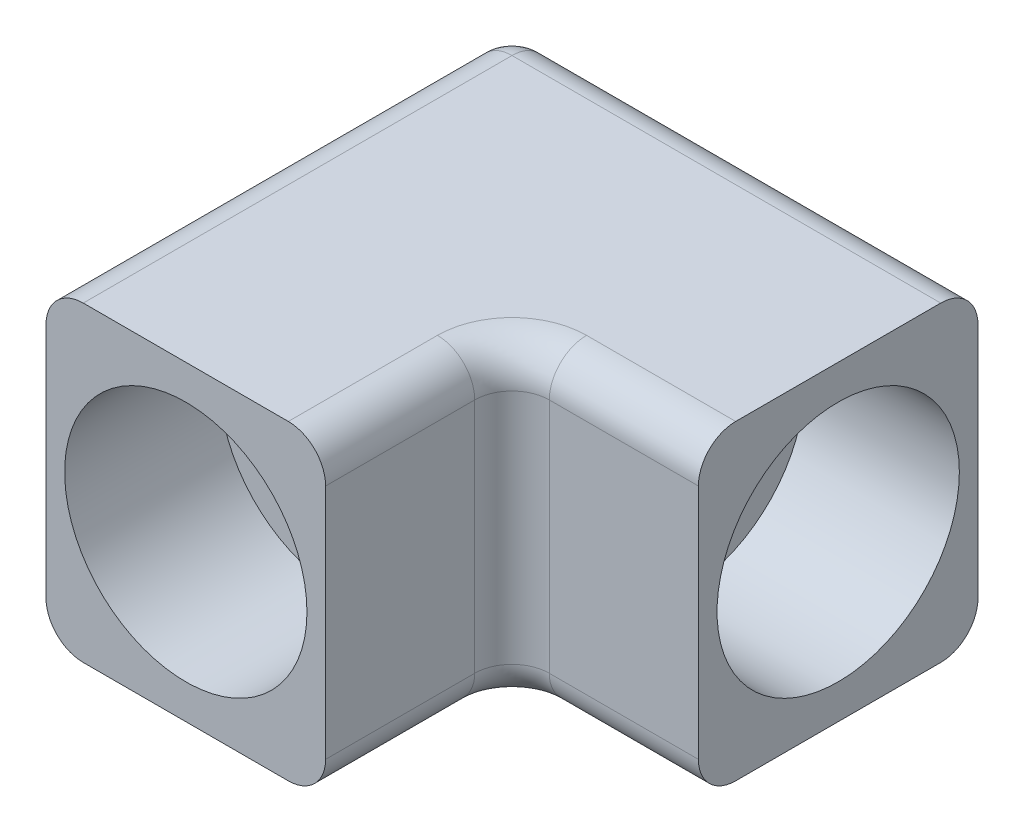
ISO-10303-21;
HEADER;
FILE_DESCRIPTION(('STEP AP214'),'2;1');
FILE_NAME('part.step','',(''),(''),'','','');
FILE_SCHEMA(('AUTOMOTIVE_DESIGN { 1 0 10303 214 1 1 1 1 }'));
ENDSEC;
DATA;
#1=APPLICATION_CONTEXT('core data for automotive mechanical design processes');
#2=APPLICATION_PROTOCOL_DEFINITION('international standard','automotive_design',2000,#1);
#3=PRODUCT_CONTEXT('',#1,'mechanical');
#4=PRODUCT('Part','Part','',(#3));
#5=PRODUCT_RELATED_PRODUCT_CATEGORY('part','',(#4));
#6=PRODUCT_DEFINITION_FORMATION('','',#4);
#7=PRODUCT_DEFINITION_CONTEXT('part definition',#1,'design');
#8=PRODUCT_DEFINITION('design','',#6,#7);
#9=PRODUCT_DEFINITION_SHAPE('','',#8);
#10=(LENGTH_UNIT() NAMED_UNIT(*) SI_UNIT(.MILLI.,.METRE.));
#11=(NAMED_UNIT(*) PLANE_ANGLE_UNIT() SI_UNIT($,.RADIAN.));
#12=(NAMED_UNIT(*) SI_UNIT($,.STERADIAN.) SOLID_ANGLE_UNIT());
#13=UNCERTAINTY_MEASURE_WITH_UNIT(LENGTH_MEASURE(1.E-05),#10,'distance_accuracy_value','');
#14=(GEOMETRIC_REPRESENTATION_CONTEXT(3) GLOBAL_UNCERTAINTY_ASSIGNED_CONTEXT((#13)) GLOBAL_UNIT_ASSIGNED_CONTEXT((#10,
#11,#12)) REPRESENTATION_CONTEXT('',''));
#15=CARTESIAN_POINT('',(0.,0.,0.));
#16=DIRECTION('',(0.,0.,1.));
#17=DIRECTION('',(1.,0.,0.));
#18=AXIS2_PLACEMENT_3D('',#15,#16,#17);
#19=CARTESIAN_POINT('',(0.,0.,0.));
#20=DIRECTION('',(0.,1.,0.));
#21=DIRECTION('',(0.,0.,1.));
#22=AXIS2_PLACEMENT_3D('',#19,#20,#21);
#23=PLANE('',#22);
#24=DIRECTION('',(-1.,0.,0.));
#25=VECTOR('',#24,1.);
#26=CARTESIAN_POINT('',(0.,0.,5.));
#27=LINE('',#26,#25);
#28=CARTESIAN_POINT('',(5.5,0.,5.));
#29=VERTEX_POINT('',#28);
#30=CARTESIAN_POINT('',(-5.5,0.,5.));
#31=VERTEX_POINT('',#30);
#32=EDGE_CURVE('E392',#29,#31,#27,.T.);
#33=ORIENTED_EDGE('',*,*,#32,.T.);
#34=DIRECTION('',(0.,0.,-1.));
#35=VECTOR('',#34,1.);
#36=CARTESIAN_POINT('',(-5.49999999999999,0.,-20.));
#37=LINE('',#36,#35);
#38=CARTESIAN_POINT('',(-5.49999999999999,0.,-9.03589838486224));
#39=VERTEX_POINT('',#38);
#40=EDGE_CURVE('E266',#31,#39,#37,.T.);
#41=ORIENTED_EDGE('',*,*,#40,.T.);
#42=CARTESIAN_POINT('',(0.,0.,-12.5));
#43=DIRECTION('',(0.,-1.,0.));
#44=DIRECTION('',(0.,0.,-1.));
#45=AXIS2_PLACEMENT_3D('',#42,#43,#44);
#46=CIRCLE('',#45,6.5);
#47=CARTESIAN_POINT('',(3.46410161513776,0.,-18.));
#48=VERTEX_POINT('',#47);
#49=EDGE_CURVE('E480',#48,#39,#46,.T.);
#50=ORIENTED_EDGE('',*,*,#49,.F.);
#51=DIRECTION('',(1.,0.,0.));
#52=VECTOR('',#51,1.);
#53=CARTESIAN_POINT('',(17.5,0.,-18.));
#54=LINE('',#53,#52);
#55=CARTESIAN_POINT('',(17.5,0.,-18.));
#56=VERTEX_POINT('',#55);
#57=EDGE_CURVE('E182',#48,#56,#54,.T.);
#58=ORIENTED_EDGE('',*,*,#57,.T.);
#59=DIRECTION('',(0.,0.,-1.));
#60=VECTOR('',#59,1.);
#61=CARTESIAN_POINT('',(17.5,0.,0.));
#62=LINE('',#61,#60);
#63=CARTESIAN_POINT('',(17.5,0.,-7.));
#64=VERTEX_POINT('',#63);
#65=EDGE_CURVE('E193',#64,#56,#62,.T.);
#66=ORIENTED_EDGE('',*,*,#65,.F.);
#67=DIRECTION('',(1.,0.,0.));
#68=VECTOR('',#67,1.);
#69=CARTESIAN_POINT('',(0.,0.,-7.));
#70=LINE('',#69,#68);
#71=CARTESIAN_POINT('',(9.5,0.,-7.));
#72=VERTEX_POINT('',#71);
#73=EDGE_CURVE('E260',#64,#72,#70,.F.);
#74=ORIENTED_EDGE('',*,*,#73,.T.);
#75=CARTESIAN_POINT('',(9.5,0.,-3.));
#76=DIRECTION('',(0.,1.,0.));
#77=DIRECTION('',(0.,0.,1.));
#78=AXIS2_PLACEMENT_3D('',#75,#76,#77);
#79=CIRCLE('',#78,4.);
#80=CARTESIAN_POINT('',(5.5,0.,-3.));
#81=VERTEX_POINT('',#80);
#82=EDGE_CURVE('E256',#81,#72,#79,.F.);
#83=ORIENTED_EDGE('',*,*,#82,.F.);
#84=DIRECTION('',(0.,0.,-1.));
#85=VECTOR('',#84,1.);
#86=CARTESIAN_POINT('',(5.5,0.,0.));
#87=LINE('',#86,#85);
#88=EDGE_CURVE('E263',#81,#29,#87,.F.);
#89=ORIENTED_EDGE('',*,*,#88,.T.);
#90=EDGE_LOOP('',(#33,#41,#50,#58,#66,#74,#83,#89));
#91=FACE_BOUND('',#90,.T.);
#92=ADVANCED_FACE('F51',(#91),#23,.F.);
#93=CARTESIAN_POINT('',(-7.5,16.7,0.));
#94=DIRECTION('',(-1.,0.,0.));
#95=DIRECTION('',(0.,0.,1.));
#96=AXIS2_PLACEMENT_3D('',#93,#94,#95);
#97=PLANE('',#96);
#98=DIRECTION('',(0.,-1.,0.));
#99=VECTOR('',#98,1.);
#100=CARTESIAN_POINT('',(-7.49999999999999,16.7,-18.));
#101=LINE('',#100,#99);
#102=CARTESIAN_POINT('',(-7.49999999999999,14.7,-18.));
#103=VERTEX_POINT('',#102);
#104=CARTESIAN_POINT('',(-7.49999999999999,2.,-18.));
#105=VERTEX_POINT('',#104);
#106=EDGE_CURVE('E408',#103,#105,#101,.T.);
#107=ORIENTED_EDGE('',*,*,#106,.T.);
#108=DIRECTION('',(0.,0.,-1.));
#109=VECTOR('',#108,1.);
#110=CARTESIAN_POINT('',(-7.5,2.,5.));
#111=LINE('',#110,#109);
#112=CARTESIAN_POINT('',(-7.5,2.,5.));
#113=VERTEX_POINT('',#112);
#114=EDGE_CURVE('E414',#105,#113,#111,.F.);
#115=ORIENTED_EDGE('',*,*,#114,.T.);
#116=DIRECTION('',(0.,-1.,0.));
#117=VECTOR('',#116,1.);
#118=CARTESIAN_POINT('',(-7.5,16.7,5.));
#119=LINE('',#118,#117);
#120=CARTESIAN_POINT('',(-7.5,14.7,5.));
#121=VERTEX_POINT('',#120);
#122=EDGE_CURVE('E518',#121,#113,#119,.T.);
#123=ORIENTED_EDGE('',*,*,#122,.F.);
#124=DIRECTION('',(0.,0.,-1.));
#125=VECTOR('',#124,1.);
#126=CARTESIAN_POINT('',(-7.5,14.7,0.));
#127=LINE('',#126,#125);
#128=EDGE_CURVE('E410',#121,#103,#127,.T.);
#129=ORIENTED_EDGE('',*,*,#128,.T.);
#130=EDGE_LOOP('',(#107,#115,#123,#129));
#131=FACE_BOUND('',#130,.T.);
#132=ADVANCED_FACE('F340',(#131),#97,.T.);
#133=CARTESIAN_POINT('',(0.,16.7,5.));
#134=DIRECTION('',(0.,0.,1.));
#135=DIRECTION('',(1.,0.,0.));
#136=AXIS2_PLACEMENT_3D('',#133,#134,#135);
#137=PLANE('',#136);
#138=CARTESIAN_POINT('',(0.,8.35,5.));
#139=DIRECTION('',(0.,0.,1.));
#140=DIRECTION('',(1.,0.,0.));
#141=AXIS2_PLACEMENT_3D('',#138,#139,#140);
#142=CIRCLE('',#141,6.5);
#143=CARTESIAN_POINT('',(6.5,8.35,5.));
#144=VERTEX_POINT('',#143);
#145=EDGE_CURVE('E496',#144,#144,#142,.T.);
#146=ORIENTED_EDGE('',*,*,#145,.F.);
#147=EDGE_LOOP('',(#146));
#148=FACE_BOUND('',#147,.T.);
#149=DIRECTION('',(0.,-1.,0.));
#150=VECTOR('',#149,1.);
#151=CARTESIAN_POINT('',(7.5,16.7,5.));
#152=LINE('',#151,#150);
#153=CARTESIAN_POINT('',(7.5,14.7,5.));
#154=VERTEX_POINT('',#153);
#155=CARTESIAN_POINT('',(7.5,2.,5.));
#156=VERTEX_POINT('',#155);
#157=EDGE_CURVE('E177',#154,#156,#152,.T.);
#158=ORIENTED_EDGE('',*,*,#157,.F.);
#159=CARTESIAN_POINT('',(5.5,14.7,5.));
#160=DIRECTION('',(0.,0.,1.));
#161=DIRECTION('',(1.,0.,0.));
#162=AXIS2_PLACEMENT_3D('',#159,#160,#161);
#163=CIRCLE('',#162,2.);
#164=CARTESIAN_POINT('',(5.5,16.7,5.));
#165=VERTEX_POINT('',#164);
#166=EDGE_CURVE('E171',#154,#165,#163,.T.);
#167=ORIENTED_EDGE('',*,*,#166,.T.);
#168=DIRECTION('',(-1.,0.,0.));
#169=VECTOR('',#168,1.);
#170=CARTESIAN_POINT('',(0.,16.7,5.));
#171=LINE('',#170,#169);
#172=CARTESIAN_POINT('',(-5.5,16.7,5.));
#173=VERTEX_POINT('',#172);
#174=EDGE_CURVE('E174',#165,#173,#171,.T.);
#175=ORIENTED_EDGE('',*,*,#174,.T.);
#176=CARTESIAN_POINT('',(-5.5,14.7,5.));
#177=DIRECTION('',(0.,0.,1.));
#178=DIRECTION('',(1.,0.,0.));
#179=AXIS2_PLACEMENT_3D('',#176,#177,#178);
#180=CIRCLE('',#179,2.);
#181=EDGE_CURVE('E243',#173,#121,#180,.T.);
#182=ORIENTED_EDGE('',*,*,#181,.T.);
#183=ORIENTED_EDGE('',*,*,#122,.T.);
#184=CARTESIAN_POINT('',(-5.5,2.,5.));
#185=DIRECTION('',(0.,0.,1.));
#186=DIRECTION('',(1.,0.,0.));
#187=AXIS2_PLACEMENT_3D('',#184,#185,#186);
#188=CIRCLE('',#187,2.);
#189=EDGE_CURVE('E183',#113,#31,#188,.T.);
#190=ORIENTED_EDGE('',*,*,#189,.T.);
#191=ORIENTED_EDGE('',*,*,#32,.F.);
#192=CARTESIAN_POINT('',(5.5,2.,5.));
#193=DIRECTION('',(0.,0.,1.));
#194=DIRECTION('',(1.,0.,0.));
#195=AXIS2_PLACEMENT_3D('',#192,#193,#194);
#196=CIRCLE('',#195,2.);
#197=EDGE_CURVE('E240',#29,#156,#196,.T.);
#198=ORIENTED_EDGE('',*,*,#197,.T.);
#199=EDGE_LOOP('',(#158,#167,#175,#182,#183,#190,#191,#198));
#200=FACE_BOUND('',#199,.T.);
#201=ADVANCED_FACE('F173',(#148,#200),#137,.T.);
#202=CARTESIAN_POINT('',(7.5,16.7,0.));
#203=DIRECTION('',(-1.,0.,0.));
#204=DIRECTION('',(0.,0.,1.));
#205=AXIS2_PLACEMENT_3D('',#202,#203,#204);
#206=PLANE('',#205);
#207=DIRECTION('',(0.,-1.,0.));
#208=VECTOR('',#207,1.);
#209=CARTESIAN_POINT('',(7.5,16.7,-3.));
#210=LINE('',#209,#208);
#211=CARTESIAN_POINT('',(7.5,2.,-3.));
#212=VERTEX_POINT('',#211);
#213=CARTESIAN_POINT('',(7.5,14.7,-3.));
#214=VERTEX_POINT('',#213);
#215=EDGE_CURVE('E231',#212,#214,#210,.F.);
#216=ORIENTED_EDGE('',*,*,#215,.T.);
#217=DIRECTION('',(0.,0.,-1.));
#218=VECTOR('',#217,1.);
#219=CARTESIAN_POINT('',(7.5,14.7,5.));
#220=LINE('',#219,#218);
#221=EDGE_CURVE('E237',#214,#154,#220,.F.);
#222=ORIENTED_EDGE('',*,*,#221,.T.);
#223=ORIENTED_EDGE('',*,*,#157,.T.);
#224=DIRECTION('',(0.,0.,-1.));
#225=VECTOR('',#224,1.);
#226=CARTESIAN_POINT('',(7.5,2.,0.));
#227=LINE('',#226,#225);
#228=EDGE_CURVE('E234',#156,#212,#227,.T.);
#229=ORIENTED_EDGE('',*,*,#228,.T.);
#230=EDGE_LOOP('',(#216,#222,#223,#229));
#231=FACE_BOUND('',#230,.T.);
#232=ADVANCED_FACE('F333',(#231),#206,.F.);
#233=CARTESIAN_POINT('',(0.,16.7,-5.));
#234=DIRECTION('',(0.,0.,-1.));
#235=DIRECTION('',(-1.,0.,0.));
#236=AXIS2_PLACEMENT_3D('',#233,#234,#235);
#237=PLANE('',#236);
#238=DIRECTION('',(0.,-1.,0.));
#239=VECTOR('',#238,1.);
#240=CARTESIAN_POINT('',(17.5,16.7,-5.));
#241=LINE('',#240,#239);
#242=CARTESIAN_POINT('',(17.5,14.7,-5.));
#243=VERTEX_POINT('',#242);
#244=CARTESIAN_POINT('',(17.5,2.,-5.));
#245=VERTEX_POINT('',#244);
#246=EDGE_CURVE('E512',#243,#245,#241,.T.);
#247=ORIENTED_EDGE('',*,*,#246,.F.);
#248=DIRECTION('',(1.,0.,0.));
#249=VECTOR('',#248,1.);
#250=CARTESIAN_POINT('',(7.5,14.7,-5.));
#251=LINE('',#250,#249);
#252=CARTESIAN_POINT('',(9.5,14.7,-5.));
#253=VERTEX_POINT('',#252);
#254=EDGE_CURVE('E228',#243,#253,#251,.F.);
#255=ORIENTED_EDGE('',*,*,#254,.T.);
#256=DIRECTION('',(0.,-1.,0.));
#257=VECTOR('',#256,1.);
#258=CARTESIAN_POINT('',(9.5,0.,-5.));
#259=LINE('',#258,#257);
#260=CARTESIAN_POINT('',(9.5,2.,-5.));
#261=VERTEX_POINT('',#260);
#262=EDGE_CURVE('E222',#253,#261,#259,.T.);
#263=ORIENTED_EDGE('',*,*,#262,.T.);
#264=DIRECTION('',(1.,0.,0.));
#265=VECTOR('',#264,1.);
#266=CARTESIAN_POINT('',(0.,2.,-5.));
#267=LINE('',#266,#265);
#268=EDGE_CURVE('E225',#261,#245,#267,.T.);
#269=ORIENTED_EDGE('',*,*,#268,.T.);
#270=EDGE_LOOP('',(#247,#255,#263,#269));
#271=FACE_BOUND('',#270,.T.);
#272=ADVANCED_FACE('F329',(#271),#237,.F.);
#273=CARTESIAN_POINT('',(17.5,16.7,0.));
#274=DIRECTION('',(-1.,0.,0.));
#275=DIRECTION('',(0.,0.,1.));
#276=AXIS2_PLACEMENT_3D('',#273,#274,#275);
#277=PLANE('',#276);
#278=CARTESIAN_POINT('',(17.5,8.35,-12.5));
#279=DIRECTION('',(1.,0.,0.));
#280=DIRECTION('',(0.,0.,-1.));
#281=AXIS2_PLACEMENT_3D('',#278,#279,#280);
#282=CIRCLE('',#281,6.5);
#283=CARTESIAN_POINT('',(17.5,8.35,-19.));
#284=VERTEX_POINT('',#283);
#285=EDGE_CURVE('E488',#284,#284,#282,.T.);
#286=ORIENTED_EDGE('',*,*,#285,.F.);
#287=EDGE_LOOP('',(#286));
#288=FACE_BOUND('',#287,.T.);
#289=DIRECTION('',(0.,0.,-1.));
#290=VECTOR('',#289,1.);
#291=CARTESIAN_POINT('',(17.5,16.7,0.));
#292=LINE('',#291,#290);
#293=CARTESIAN_POINT('',(17.5,16.7,-7.));
#294=VERTEX_POINT('',#293);
#295=CARTESIAN_POINT('',(17.5,16.7,-18.));
#296=VERTEX_POINT('',#295);
#297=EDGE_CURVE('E192',#294,#296,#292,.T.);
#298=ORIENTED_EDGE('',*,*,#297,.F.);
#299=CARTESIAN_POINT('',(17.5,14.7,-7.));
#300=DIRECTION('',(-1.,0.,0.));
#301=DIRECTION('',(0.,0.,1.));
#302=AXIS2_PLACEMENT_3D('',#299,#300,#301);
#303=CIRCLE('',#302,2.);
#304=EDGE_CURVE('E219',#294,#243,#303,.F.);
#305=ORIENTED_EDGE('',*,*,#304,.T.);
#306=ORIENTED_EDGE('',*,*,#246,.T.);
#307=CARTESIAN_POINT('',(17.5,2.,-7.));
#308=DIRECTION('',(-1.,0.,0.));
#309=DIRECTION('',(0.,0.,1.));
#310=AXIS2_PLACEMENT_3D('',#307,#308,#309);
#311=CIRCLE('',#310,2.);
#312=EDGE_CURVE('E216',#245,#64,#311,.F.);
#313=ORIENTED_EDGE('',*,*,#312,.T.);
#314=ORIENTED_EDGE('',*,*,#65,.T.);
#315=CARTESIAN_POINT('',(17.5,2.,-18.));
#316=DIRECTION('',(-1.,0.,0.));
#317=DIRECTION('',(0.,0.,1.));
#318=AXIS2_PLACEMENT_3D('',#315,#316,#317);
#319=CIRCLE('',#318,2.);
#320=CARTESIAN_POINT('',(17.5,2.,-20.));
#321=VERTEX_POINT('',#320);
#322=EDGE_CURVE('E206',#56,#321,#319,.F.);
#323=ORIENTED_EDGE('',*,*,#322,.T.);
#324=DIRECTION('',(0.,-1.,0.));
#325=VECTOR('',#324,1.);
#326=CARTESIAN_POINT('',(17.5,16.7,-20.));
#327=LINE('',#326,#325);
#328=CARTESIAN_POINT('',(17.5,14.7,-20.));
#329=VERTEX_POINT('',#328);
#330=EDGE_CURVE('E505',#329,#321,#327,.T.);
#331=ORIENTED_EDGE('',*,*,#330,.F.);
#332=CARTESIAN_POINT('',(17.5,14.7,-18.));
#333=DIRECTION('',(-1.,0.,0.));
#334=DIRECTION('',(0.,0.,1.));
#335=AXIS2_PLACEMENT_3D('',#332,#333,#334);
#336=CIRCLE('',#335,2.);
#337=EDGE_CURVE('E213',#329,#296,#336,.F.);
#338=ORIENTED_EDGE('',*,*,#337,.T.);
#339=EDGE_LOOP('',(#298,#305,#306,#313,#314,#323,#331,#338));
#340=FACE_BOUND('',#339,.T.);
#341=ADVANCED_FACE('F326',(#288,#340),#277,.F.);
#342=CARTESIAN_POINT('',(0.,16.7,-20.));
#343=DIRECTION('',(0.,0.,-1.));
#344=DIRECTION('',(-1.,0.,0.));
#345=AXIS2_PLACEMENT_3D('',#342,#343,#344);
#346=PLANE('',#345);
#347=DIRECTION('',(0.,-1.,0.));
#348=VECTOR('',#347,1.);
#349=CARTESIAN_POINT('',(-5.49999999999999,16.7,-20.));
#350=LINE('',#349,#348);
#351=CARTESIAN_POINT('',(-5.49999999999999,2.,-20.));
#352=VERTEX_POINT('',#351);
#353=CARTESIAN_POINT('',(-5.49999999999999,14.7,-20.));
#354=VERTEX_POINT('',#353);
#355=EDGE_CURVE('E68',#352,#354,#350,.F.);
#356=ORIENTED_EDGE('',*,*,#355,.T.);
#357=DIRECTION('',(1.,0.,0.));
#358=VECTOR('',#357,1.);
#359=CARTESIAN_POINT('',(0.,14.7,-20.));
#360=LINE('',#359,#358);
#361=EDGE_CURVE('E12',#354,#329,#360,.T.);
#362=ORIENTED_EDGE('',*,*,#361,.T.);
#363=ORIENTED_EDGE('',*,*,#330,.T.);
#364=DIRECTION('',(1.,0.,0.));
#365=VECTOR('',#364,1.);
#366=CARTESIAN_POINT('',(-7.5,2.,-20.));
#367=LINE('',#366,#365);
#368=EDGE_CURVE('E61',#321,#352,#367,.F.);
#369=ORIENTED_EDGE('',*,*,#368,.T.);
#370=EDGE_LOOP('',(#356,#362,#363,#369));
#371=FACE_BOUND('',#370,.T.);
#372=ADVANCED_FACE('F320',(#371),#346,.T.);
#373=CARTESIAN_POINT('',(0.,16.7,0.));
#374=DIRECTION('',(0.,1.,0.));
#375=DIRECTION('',(0.,0.,1.));
#376=AXIS2_PLACEMENT_3D('',#373,#374,#375);
#377=PLANE('',#376);
#378=CARTESIAN_POINT('',(9.5,16.7,-3.));
#379=DIRECTION('',(0.,1.,0.));
#380=DIRECTION('',(0.,0.,1.));
#381=AXIS2_PLACEMENT_3D('',#378,#379,#380);
#382=CIRCLE('',#381,4.);
#383=CARTESIAN_POINT('',(9.5,16.7,-7.));
#384=VERTEX_POINT('',#383);
#385=CARTESIAN_POINT('',(5.5,16.7,-3.));
#386=VERTEX_POINT('',#385);
#387=EDGE_CURVE('E201',#384,#386,#382,.T.);
#388=ORIENTED_EDGE('',*,*,#387,.F.);
#389=DIRECTION('',(1.,0.,0.));
#390=VECTOR('',#389,1.);
#391=CARTESIAN_POINT('',(17.5,16.7,-7.));
#392=LINE('',#391,#390);
#393=EDGE_CURVE('E200',#384,#294,#392,.T.);
#394=ORIENTED_EDGE('',*,*,#393,.T.);
#395=ORIENTED_EDGE('',*,*,#297,.T.);
#396=DIRECTION('',(1.,0.,0.));
#397=VECTOR('',#396,1.);
#398=CARTESIAN_POINT('',(0.,16.7,-18.));
#399=LINE('',#398,#397);
#400=CARTESIAN_POINT('',(-5.49999999999999,16.7,-18.));
#401=VERTEX_POINT('',#400);
#402=EDGE_CURVE('E521',#296,#401,#399,.F.);
#403=ORIENTED_EDGE('',*,*,#402,.T.);
#404=DIRECTION('',(0.,0.,-1.));
#405=VECTOR('',#404,1.);
#406=CARTESIAN_POINT('',(-5.5,16.7,0.));
#407=LINE('',#406,#405);
#408=EDGE_CURVE('E190',#401,#173,#407,.F.);
#409=ORIENTED_EDGE('',*,*,#408,.T.);
#410=ORIENTED_EDGE('',*,*,#174,.F.);
#411=DIRECTION('',(0.,0.,-1.));
#412=VECTOR('',#411,1.);
#413=CARTESIAN_POINT('',(5.5,16.7,-5.));
#414=LINE('',#413,#412);
#415=EDGE_CURVE('E187',#165,#386,#414,.T.);
#416=ORIENTED_EDGE('',*,*,#415,.T.);
#417=EDGE_LOOP('',(#388,#394,#395,#403,#409,#410,#416));
#418=FACE_BOUND('',#417,.T.);
#419=ADVANCED_FACE('F186',(#418),#377,.T.);
#420=CARTESIAN_POINT('',(-5.49999999999999,0.,-15.9641016151378));
#421=VERTEX_POINT('',#420);
#422=CARTESIAN_POINT('',(-3.46410161513776,0.,-18.));
#423=VERTEX_POINT('',#422);
#424=EDGE_CURVE('E445',#421,#423,#46,.T.);
#425=ORIENTED_EDGE('',*,*,#424,.F.);
#426=DIRECTION('',(0.,0.,-1.));
#427=VECTOR('',#426,1.);
#428=CARTESIAN_POINT('',(-5.49999999999999,0.,-20.));
#429=LINE('',#428,#427);
#430=CARTESIAN_POINT('',(-5.49999999999999,0.,-18.));
#431=VERTEX_POINT('',#430);
#432=EDGE_CURVE('E253',#421,#431,#429,.T.);
#433=ORIENTED_EDGE('',*,*,#432,.T.);
#434=DIRECTION('',(1.,0.,0.));
#435=VECTOR('',#434,1.);
#436=CARTESIAN_POINT('',(17.5,0.,-18.));
#437=LINE('',#436,#435);
#438=EDGE_CURVE('E250',#431,#423,#437,.T.);
#439=ORIENTED_EDGE('',*,*,#438,.T.);
#440=EDGE_LOOP('',(#425,#433,#439));
#441=FACE_BOUND('',#440,.T.);
#442=ADVANCED_FACE('F316',(#441),#23,.F.);
#443=CARTESIAN_POINT('',(0.,16.7,-3.3));
#444=DIRECTION('',(0.,0.,-1.));
#445=DIRECTION('',(-1.,0.,0.));
#446=AXIS2_PLACEMENT_3D('',#443,#444,#445);
#447=PLANE('',#446);
#448=CARTESIAN_POINT('',(0.,8.35,-3.3));
#449=DIRECTION('',(0.,0.,-1.));
#450=DIRECTION('',(-1.,0.,0.));
#451=AXIS2_PLACEMENT_3D('',#448,#449,#450);
#452=CIRCLE('',#451,6.5);
#453=CARTESIAN_POINT('',(-6.5,8.35,-3.3));
#454=VERTEX_POINT('',#453);
#455=EDGE_CURVE('E399',#454,#454,#452,.F.);
#456=ORIENTED_EDGE('',*,*,#455,.T.);
#457=EDGE_LOOP('',(#456));
#458=FACE_BOUND('',#457,.T.);
#459=ADVANCED_FACE('F312',(#458),#447,.F.);
#460=CARTESIAN_POINT('',(0.,8.35,-38.3847763108502));
#461=DIRECTION('',(0.,0.,1.));
#462=DIRECTION('',(1.,0.,0.));
#463=AXIS2_PLACEMENT_3D('',#460,#461,#462);
#464=CYLINDRICAL_SURFACE('',#463,6.5);
#465=ORIENTED_EDGE('',*,*,#145,.T.);
#466=EDGE_LOOP('',(#465));
#467=FACE_BOUND('',#466,.T.);
#468=ORIENTED_EDGE('',*,*,#455,.F.);
#469=EDGE_LOOP('',(#468));
#470=FACE_BOUND('',#469,.T.);
#471=ADVANCED_FACE('F308',(#467,#470),#464,.F.);
#472=CARTESIAN_POINT('',(9.2,16.7,0.));
#473=DIRECTION('',(-1.,0.,0.));
#474=DIRECTION('',(0.,0.,1.));
#475=AXIS2_PLACEMENT_3D('',#472,#473,#474);
#476=PLANE('',#475);
#477=CARTESIAN_POINT('',(9.2,8.35,-12.5));
#478=DIRECTION('',(-1.,0.,0.));
#479=DIRECTION('',(0.,0.,1.));
#480=AXIS2_PLACEMENT_3D('',#477,#478,#479);
#481=CIRCLE('',#480,6.5);
#482=CARTESIAN_POINT('',(9.2,8.35,-6.));
#483=VERTEX_POINT('',#482);
#484=EDGE_CURVE('E492',#483,#483,#481,.F.);
#485=ORIENTED_EDGE('',*,*,#484,.T.);
#486=EDGE_LOOP('',(#485));
#487=FACE_BOUND('',#486,.T.);
#488=ADVANCED_FACE('F304',(#487),#476,.F.);
#489=CARTESIAN_POINT('',(-25.8847763108502,8.35,-12.5));
#490=DIRECTION('',(1.,0.,0.));
#491=DIRECTION('',(0.,0.,-1.));
#492=AXIS2_PLACEMENT_3D('',#489,#490,#491);
#493=CYLINDRICAL_SURFACE('',#492,6.5);
#494=ORIENTED_EDGE('',*,*,#285,.T.);
#495=EDGE_LOOP('',(#494));
#496=FACE_BOUND('',#495,.T.);
#497=ORIENTED_EDGE('',*,*,#484,.F.);
#498=EDGE_LOOP('',(#497));
#499=FACE_BOUND('',#498,.T.);
#500=ADVANCED_FACE('F300',(#496,#499),#493,.F.);
#501=CARTESIAN_POINT('',(0.,14.7,0.));
#502=DIRECTION('',(0.,1.,0.));
#503=DIRECTION('',(0.,0.,1.));
#504=AXIS2_PLACEMENT_3D('',#501,#502,#503);
#505=PLANE('',#504);
#506=CARTESIAN_POINT('',(0.,14.7,-12.5));
#507=DIRECTION('',(0.,1.,0.));
#508=DIRECTION('',(0.,0.,1.));
#509=AXIS2_PLACEMENT_3D('',#506,#507,#508);
#510=CIRCLE('',#509,6.5);
#511=CARTESIAN_POINT('',(0.,14.7,-6.00000000000001));
#512=VERTEX_POINT('',#511);
#513=EDGE_CURVE('E483',#512,#512,#510,.F.);
#514=ORIENTED_EDGE('',*,*,#513,.T.);
#515=EDGE_LOOP('',(#514));
#516=FACE_BOUND('',#515,.T.);
#517=ADVANCED_FACE('F295',(#516),#505,.F.);
#518=CARTESIAN_POINT('',(0.,35.0847763108502,-12.5));
#519=DIRECTION('',(0.,-1.,0.));
#520=DIRECTION('',(0.,0.,-1.));
#521=AXIS2_PLACEMENT_3D('',#518,#519,#520);
#522=CYLINDRICAL_SURFACE('',#521,6.5);
#523=ORIENTED_EDGE('',*,*,#49,.T.);
#524=CARTESIAN_POINT('',(-5.49999999999999,0.,-9.03589838486224));
#525=CARTESIAN_POINT('',(-5.54137417625027,4.41309118592946E-06,-9.10158693197185));
#526=CARTESIAN_POINT('',(-5.58155912407696,0.00128327525634518,-9.16800075300959));
#527=CARTESIAN_POINT('',(-5.65948367091043,0.00598603396966659,-9.30214803250205));
#528=CARTESIAN_POINT('',(-5.69722402362089,0.00940926587103663,-9.36988107576378));
#529=CARTESIAN_POINT('',(-5.80660608775077,0.0222786246625864,-9.57472007729104));
#530=CARTESIAN_POINT('',(-5.87453285887567,0.0343268478442496,-9.71366302972632));
#531=CARTESIAN_POINT('',(-6.00046172247442,0.0625481786763816,-9.99629875291769));
#532=CARTESIAN_POINT('',(-6.05841625954546,0.0787401825393546,-10.1400105853616));
#533=CARTESIAN_POINT('',(-6.16390035659045,0.112593109573347,-10.4311095857806));
#534=CARTESIAN_POINT('',(-6.21142525343478,0.130254684947761,-10.578498365067));
#535=CARTESIAN_POINT('',(-6.29962001711246,0.166130953011706,-10.8896557354892));
#536=CARTESIAN_POINT('',(-6.33930460671889,0.184255189755174,-11.0537154767308));
#537=CARTESIAN_POINT('',(-6.40584291969855,0.216514321735528,-11.3847977416374));
#538=CARTESIAN_POINT('',(-6.43269848595052,0.230649789836295,-11.5518198361857));
#539=CARTESIAN_POINT('',(-6.47325427142238,0.252626729050026,-11.8872881620843));
#540=CARTESIAN_POINT('',(-6.48700054140047,0.260490216524912,-12.0557272956194));
#541=CARTESIAN_POINT('',(-6.50132034639376,0.268691429456547,-12.3933457432455));
#542=CARTESIAN_POINT('',(-6.50189488734993,0.269029729620947,-12.5625249998254));
#543=CARTESIAN_POINT('',(-6.48988111080138,0.262133521443026,-12.8998131698731));
#544=CARTESIAN_POINT('',(-6.47732673933394,0.254918542761482,-13.0679237185465));
#545=CARTESIAN_POINT('',(-6.43927069440576,0.234147924038205,-13.4022840008301));
#546=CARTESIAN_POINT('',(-6.41376676209155,0.220591177804282,-13.5685334046192));
#547=CARTESIAN_POINT('',(-6.3499806980559,0.189256336235137,-13.8986007688485));
#548=CARTESIAN_POINT('',(-6.31166428907889,0.17146695454288,-14.0624109624294));
#549=CARTESIAN_POINT('',(-6.22251222100614,0.134442840531521,-14.3864177103806));
#550=CARTESIAN_POINT('',(-6.17167707409863,0.115208167367047,-14.5466144122998));
#551=CARTESIAN_POINT('',(-6.07505296676553,0.0840025568601343,-14.8146032731745));
#552=CARTESIAN_POINT('',(-6.0324399604075,0.0716030960155246,-14.923500757187));
#553=CARTESIAN_POINT('',(-5.94133694910821,0.0487373143073405,-15.1389755660589));
#554=CARTESIAN_POINT('',(-5.89284933007318,0.0382702129683306,-15.2455538122422));
#555=CARTESIAN_POINT('',(-5.79023946893215,0.0204876373557316,-15.4558000915397));
#556=CARTESIAN_POINT('',(-5.73613694178519,0.0131615702419487,-15.5594767861334));
#557=CARTESIAN_POINT('',(-5.62226909253078,0.00292765350241905,-15.7640200642253));
#558=CARTESIAN_POINT('',(-5.56249828895712,2.41279131589428E-05,-15.8648838029801));
#559=CARTESIAN_POINT('',(-5.5,0.,-15.9641016151378));
#560=B_SPLINE_CURVE_WITH_KNOTS('',3,(#524,#525,#526,#527,#528,#529,#530,#531,#532,#533,#534,
#535,#536,#537,#538,#539,#540,#541,#542,#543,#544,#545,#546,#547,#548,#549,#550,#551,#552,#553,
#554,#555,#556,#557,#558,#559),.UNSPECIFIED.,.F.,.F.,(4,2,2,2,2,2,2,2,2,2,2,2,2,2,2,2,2,4),(0.,
0.232841785767266,0.465611437973955,0.930454373514362,1.39745605005863,1.86466610125375,
2.37341924014213,2.88209927506505,3.38898574768917,3.89583350864784,4.40137399959099,
4.90700270467626,5.41399508887887,5.92096673357874,6.27358370273993,6.62605793765222,
6.97733395378477,7.32895320185565),.UNSPECIFIED.);
#561=EDGE_CURVE('E279',#39,#421,#560,.T.);
#562=ORIENTED_EDGE('',*,*,#561,.T.);
#563=ORIENTED_EDGE('',*,*,#424,.T.);
#564=CARTESIAN_POINT('',(-3.46410161513776,0.,-18.));
#565=CARTESIAN_POINT('',(-3.39841306802816,4.41309118593538E-06,-18.0413741762503));
#566=CARTESIAN_POINT('',(-3.33199924699042,0.00128327525634515,-18.081559124077));
#567=CARTESIAN_POINT('',(-3.19785196749796,0.00598603396966647,-18.1594836709104));
#568=CARTESIAN_POINT('',(-3.13011892423622,0.00940926587103648,-18.1972240236209));
#569=CARTESIAN_POINT('',(-2.92527992270897,0.0222786246625861,-18.3066060877508));
#570=CARTESIAN_POINT('',(-2.78633697027368,0.0343268478442493,-18.3745328588757));
#571=CARTESIAN_POINT('',(-2.50370124708232,0.0625481786763815,-18.5004617224744));
#572=CARTESIAN_POINT('',(-2.35998941463846,0.0787401825393547,-18.5584162595455));
#573=CARTESIAN_POINT('',(-2.06889041421937,0.112593109573347,-18.6639003565905));
#574=CARTESIAN_POINT('',(-1.92150163493304,0.130254684947761,-18.7114252534348));
#575=CARTESIAN_POINT('',(-1.61034426451084,0.166130953011705,-18.7996200171125));
#576=CARTESIAN_POINT('',(-1.44628452326921,0.184255189755173,-18.8393046067189));
#577=CARTESIAN_POINT('',(-1.11520225836257,0.216514321735527,-18.9058429196986));
#578=CARTESIAN_POINT('',(-0.948180163814354,0.230649789836295,-18.9326984859505));
#579=CARTESIAN_POINT('',(-0.612711837915674,0.252626729050027,-18.9732542714224));
#580=CARTESIAN_POINT('',(-0.444272704380633,0.260490216524912,-18.9870005414005));
#581=CARTESIAN_POINT('',(-0.106654256754553,0.268691429456547,-19.0013203463938));
#582=CARTESIAN_POINT('',(0.0625249998253712,0.269029729620946,-19.0018948873499));
#583=CARTESIAN_POINT('',(0.399813169873052,0.262133521443025,-18.9898811108014));
#584=CARTESIAN_POINT('',(0.567923718546449,0.254918542761482,-18.9773267393339));
#585=CARTESIAN_POINT('',(0.902284000830086,0.234147924038205,-18.9392706944058));
#586=CARTESIAN_POINT('',(1.06853340461924,0.220591177804282,-18.9137667620916));
#587=CARTESIAN_POINT('',(1.39860076884851,0.189256336235137,-18.8499806980559));
#588=CARTESIAN_POINT('',(1.56241096242938,0.17146695454288,-18.8116642890789));
#589=CARTESIAN_POINT('',(1.88641771038062,0.134442840531521,-18.7225122210061));
#590=CARTESIAN_POINT('',(2.04661441229978,0.115208167367047,-18.6716770740986));
#591=CARTESIAN_POINT('',(2.31460327317452,0.0840025568601344,-18.5750529667655));
#592=CARTESIAN_POINT('',(2.42350075718703,0.0716030960155246,-18.5324399604075));
#593=CARTESIAN_POINT('',(2.63897556605893,0.0487373143073402,-18.4413369491082));
#594=CARTESIAN_POINT('',(2.74555381224219,0.0382702129683301,-18.3928493300732));
#595=CARTESIAN_POINT('',(2.95580009153973,0.0204876373557311,-18.2902394689322));
#596=CARTESIAN_POINT('',(3.05947678613336,0.0131615702419486,-18.2361369417852));
#597=CARTESIAN_POINT('',(3.26402006422526,0.0029276535024194,-18.1222690925308));
#598=CARTESIAN_POINT('',(3.36488380298007,2.41279131593558E-05,-18.0624982889571));
#599=CARTESIAN_POINT('',(3.46410161513776,0.,-18.));
#600=B_SPLINE_CURVE_WITH_KNOTS('',3,(#564,#565,#566,#567,#568,#569,#570,#571,#572,#573,#574,
#575,#576,#577,#578,#579,#580,#581,#582,#583,#584,#585,#586,#587,#588,#589,#590,#591,#592,#593,
#594,#595,#596,#597,#598,#599),.UNSPECIFIED.,.F.,.F.,(4,2,2,2,2,2,2,2,2,2,2,2,2,2,2,2,2,4),(0.,
0.232841785767265,0.465611437973956,0.930454373514363,1.39745605005863,1.86466610125375,
2.37341924014213,2.88209927506505,3.38898574768918,3.89583350864785,4.40137399959099,
4.90700270467626,5.41399508887888,5.92096673357874,6.27358370273993,6.62605793765222,
6.97733395378478,7.32895320185566),.UNSPECIFIED.);
#601=EDGE_CURVE('E270',#423,#48,#600,.T.);
#602=ORIENTED_EDGE('',*,*,#601,.T.);
#603=EDGE_LOOP('',(#523,#562,#563,#602));
#604=FACE_BOUND('',#603,.T.);
#605=ORIENTED_EDGE('',*,*,#513,.F.);
#606=EDGE_LOOP('',(#605));
#607=FACE_BOUND('',#606,.T.);
#608=ADVANCED_FACE('F290',(#604,#607),#522,.F.);
#609=CARTESIAN_POINT('',(0.,2.,-7.));
#610=DIRECTION('',(1.,0.,0.));
#611=DIRECTION('',(0.,0.,-1.));
#612=AXIS2_PLACEMENT_3D('',#609,#610,#611);
#613=CYLINDRICAL_SURFACE('',#612,2.);
#614=ORIENTED_EDGE('',*,*,#312,.F.);
#615=ORIENTED_EDGE('',*,*,#268,.F.);
#616=CARTESIAN_POINT('',(9.5,2.,-7.));
#617=DIRECTION('',(-1.,0.,0.));
#618=DIRECTION('',(0.,0.,1.));
#619=AXIS2_PLACEMENT_3D('',#616,#617,#618);
#620=CIRCLE('',#619,2.);
#621=EDGE_CURVE('E441',#72,#261,#620,.T.);
#622=ORIENTED_EDGE('',*,*,#621,.F.);
#623=ORIENTED_EDGE('',*,*,#73,.F.);
#624=EDGE_LOOP('',(#614,#615,#622,#623));
#625=FACE_BOUND('',#624,.T.);
#626=ADVANCED_FACE('F294',(#625),#613,.T.);
#627=CARTESIAN_POINT('',(5.5,2.,0.));
#628=DIRECTION('',(0.,0.,-1.));
#629=DIRECTION('',(-1.,0.,0.));
#630=AXIS2_PLACEMENT_3D('',#627,#628,#629);
#631=CYLINDRICAL_SURFACE('',#630,2.);
#632=ORIENTED_EDGE('',*,*,#197,.F.);
#633=ORIENTED_EDGE('',*,*,#88,.F.);
#634=CARTESIAN_POINT('',(5.5,2.,-3.));
#635=DIRECTION('',(0.,0.,-1.));
#636=DIRECTION('',(-1.,0.,0.));
#637=AXIS2_PLACEMENT_3D('',#634,#635,#636);
#638=CIRCLE('',#637,2.);
#639=EDGE_CURVE('E437',#212,#81,#638,.T.);
#640=ORIENTED_EDGE('',*,*,#639,.F.);
#641=ORIENTED_EDGE('',*,*,#228,.F.);
#642=EDGE_LOOP('',(#632,#633,#640,#641));
#643=FACE_BOUND('',#642,.T.);
#644=ADVANCED_FACE('F362',(#643),#631,.T.);
#645=CARTESIAN_POINT('',(9.5,2.,-3.));
#646=DIRECTION('',(0.,1.,0.));
#647=DIRECTION('',(0.,0.,1.));
#648=AXIS2_PLACEMENT_3D('',#645,#646,#647);
#649=TOROIDAL_SURFACE('',#648,4.,2.);
#650=ORIENTED_EDGE('',*,*,#82,.T.);
#651=ORIENTED_EDGE('',*,*,#621,.T.);
#652=CARTESIAN_POINT('',(9.5,2.,-3.));
#653=DIRECTION('',(0.,1.,0.));
#654=DIRECTION('',(0.,0.,1.));
#655=AXIS2_PLACEMENT_3D('',#652,#653,#654);
#656=CIRCLE('',#655,2.);
#657=EDGE_CURVE('E433',#212,#261,#656,.F.);
#658=ORIENTED_EDGE('',*,*,#657,.F.);
#659=ORIENTED_EDGE('',*,*,#639,.T.);
#660=EDGE_LOOP('',(#650,#651,#658,#659));
#661=FACE_BOUND('',#660,.T.);
#662=ADVANCED_FACE('F358',(#661),#649,.T.);
#663=CARTESIAN_POINT('',(9.5,16.7,-3.));
#664=DIRECTION('',(0.,1.,0.));
#665=DIRECTION('',(0.,0.,1.));
#666=AXIS2_PLACEMENT_3D('',#663,#664,#665);
#667=CYLINDRICAL_SURFACE('',#666,2.);
#668=ORIENTED_EDGE('',*,*,#657,.T.);
#669=ORIENTED_EDGE('',*,*,#262,.F.);
#670=CARTESIAN_POINT('',(9.5,14.7,-3.));
#671=DIRECTION('',(0.,1.,0.));
#672=DIRECTION('',(0.,0.,1.));
#673=AXIS2_PLACEMENT_3D('',#670,#671,#672);
#674=CIRCLE('',#673,2.);
#675=EDGE_CURVE('E429',#214,#253,#674,.F.);
#676=ORIENTED_EDGE('',*,*,#675,.F.);
#677=ORIENTED_EDGE('',*,*,#215,.F.);
#678=EDGE_LOOP('',(#668,#669,#676,#677));
#679=FACE_BOUND('',#678,.T.);
#680=ADVANCED_FACE('F355',(#679),#667,.F.);
#681=CARTESIAN_POINT('',(5.5,14.7,0.));
#682=DIRECTION('',(0.,0.,1.));
#683=DIRECTION('',(1.,0.,0.));
#684=AXIS2_PLACEMENT_3D('',#681,#682,#683);
#685=CYLINDRICAL_SURFACE('',#684,2.);
#686=ORIENTED_EDGE('',*,*,#166,.F.);
#687=ORIENTED_EDGE('',*,*,#221,.F.);
#688=CARTESIAN_POINT('',(5.5,14.7,-3.));
#689=DIRECTION('',(0.,0.,-1.));
#690=DIRECTION('',(-1.,0.,0.));
#691=AXIS2_PLACEMENT_3D('',#688,#689,#690);
#692=CIRCLE('',#691,2.);
#693=EDGE_CURVE('E197',#386,#214,#692,.T.);
#694=ORIENTED_EDGE('',*,*,#693,.F.);
#695=ORIENTED_EDGE('',*,*,#415,.F.);
#696=EDGE_LOOP('',(#686,#687,#694,#695));
#697=FACE_BOUND('',#696,.T.);
#698=ADVANCED_FACE('F195',(#697),#685,.T.);
#699=CARTESIAN_POINT('',(9.5,14.7,-3.));
#700=DIRECTION('',(0.,1.,0.));
#701=DIRECTION('',(0.,0.,1.));
#702=AXIS2_PLACEMENT_3D('',#699,#700,#701);
#703=TOROIDAL_SURFACE('',#702,4.,2.);
#704=ORIENTED_EDGE('',*,*,#693,.T.);
#705=ORIENTED_EDGE('',*,*,#675,.T.);
#706=CARTESIAN_POINT('',(9.5,14.7,-7.));
#707=DIRECTION('',(-1.,0.,0.));
#708=DIRECTION('',(0.,0.,1.));
#709=AXIS2_PLACEMENT_3D('',#706,#707,#708);
#710=CIRCLE('',#709,2.);
#711=EDGE_CURVE('E423',#384,#253,#710,.F.);
#712=ORIENTED_EDGE('',*,*,#711,.F.);
#713=ORIENTED_EDGE('',*,*,#387,.T.);
#714=EDGE_LOOP('',(#704,#705,#712,#713));
#715=FACE_BOUND('',#714,.T.);
#716=ADVANCED_FACE('F348',(#715),#703,.T.);
#717=CARTESIAN_POINT('',(0.,14.7,-7.));
#718=DIRECTION('',(-1.,0.,0.));
#719=DIRECTION('',(0.,0.,1.));
#720=AXIS2_PLACEMENT_3D('',#717,#718,#719);
#721=CYLINDRICAL_SURFACE('',#720,2.);
#722=ORIENTED_EDGE('',*,*,#711,.T.);
#723=ORIENTED_EDGE('',*,*,#254,.F.);
#724=ORIENTED_EDGE('',*,*,#304,.F.);
#725=ORIENTED_EDGE('',*,*,#393,.F.);
#726=EDGE_LOOP('',(#722,#723,#724,#725));
#727=FACE_BOUND('',#726,.T.);
#728=ADVANCED_FACE('F345',(#727),#721,.T.);
#729=CARTESIAN_POINT('',(0.,14.7,-18.));
#730=DIRECTION('',(1.,0.,0.));
#731=DIRECTION('',(0.,0.,-1.));
#732=AXIS2_PLACEMENT_3D('',#729,#730,#731);
#733=CYLINDRICAL_SURFACE('',#732,2.);
#734=ORIENTED_EDGE('',*,*,#337,.F.);
#735=ORIENTED_EDGE('',*,*,#361,.F.);
#736=CARTESIAN_POINT('',(-5.49999999999999,14.7,-18.));
#737=DIRECTION('',(-1.,0.,0.));
#738=DIRECTION('',(0.,0.,1.));
#739=AXIS2_PLACEMENT_3D('',#736,#737,#738);
#740=CIRCLE('',#739,2.);
#741=EDGE_CURVE('E55',#401,#354,#740,.T.);
#742=ORIENTED_EDGE('',*,*,#741,.F.);
#743=ORIENTED_EDGE('',*,*,#402,.F.);
#744=EDGE_LOOP('',(#734,#735,#742,#743));
#745=FACE_BOUND('',#744,.T.);
#746=ADVANCED_FACE('F53',(#745),#733,.T.);
#747=CARTESIAN_POINT('',(-5.5,14.7,0.));
#748=DIRECTION('',(0.,0.,-1.));
#749=DIRECTION('',(-1.,0.,0.));
#750=AXIS2_PLACEMENT_3D('',#747,#748,#749);
#751=CYLINDRICAL_SURFACE('',#750,2.);
#752=ORIENTED_EDGE('',*,*,#181,.F.);
#753=ORIENTED_EDGE('',*,*,#408,.F.);
#754=CARTESIAN_POINT('',(-5.49999999999999,14.7,-18.));
#755=DIRECTION('',(0.,0.,-1.));
#756=DIRECTION('',(-1.,0.,0.));
#757=AXIS2_PLACEMENT_3D('',#754,#755,#756);
#758=CIRCLE('',#757,2.);
#759=EDGE_CURVE('E459',#103,#401,#758,.T.);
#760=ORIENTED_EDGE('',*,*,#759,.F.);
#761=ORIENTED_EDGE('',*,*,#128,.F.);
#762=EDGE_LOOP('',(#752,#753,#760,#761));
#763=FACE_BOUND('',#762,.T.);
#764=ADVANCED_FACE('F527',(#763),#751,.T.);
#765=CARTESIAN_POINT('',(-5.49999999999999,14.7,-18.));
#766=DIRECTION('',(0.,1.,0.));
#767=DIRECTION('',(-1.,0.,0.));
#768=AXIS2_PLACEMENT_3D('',#765,#766,#767);
#769=SPHERICAL_SURFACE('',#768,2.);
#770=ORIENTED_EDGE('',*,*,#759,.T.);
#771=ORIENTED_EDGE('',*,*,#741,.T.);
#772=CARTESIAN_POINT('',(-5.49999999999999,14.7,-18.));
#773=DIRECTION('',(0.,1.,0.));
#774=DIRECTION('',(0.,0.,1.));
#775=AXIS2_PLACEMENT_3D('',#772,#773,#774);
#776=CIRCLE('',#775,2.);
#777=EDGE_CURVE('E457',#103,#354,#776,.F.);
#778=ORIENTED_EDGE('',*,*,#777,.F.);
#779=EDGE_LOOP('',(#770,#771,#778));
#780=FACE_BOUND('',#779,.T.);
#781=ADVANCED_FACE('F383',(#780),#769,.T.);
#782=CARTESIAN_POINT('',(0.,2.,-18.));
#783=DIRECTION('',(-1.,0.,0.));
#784=DIRECTION('',(0.,0.,1.));
#785=AXIS2_PLACEMENT_3D('',#782,#783,#784);
#786=CYLINDRICAL_SURFACE('',#785,2.);
#787=ORIENTED_EDGE('',*,*,#601,.F.);
#788=ORIENTED_EDGE('',*,*,#438,.F.);
#789=CARTESIAN_POINT('',(-5.49999999999999,2.,-18.));
#790=DIRECTION('',(-1.,0.,0.));
#791=DIRECTION('',(0.,0.,1.));
#792=AXIS2_PLACEMENT_3D('',#789,#790,#791);
#793=CIRCLE('',#792,2.);
#794=EDGE_CURVE('E453',#352,#431,#793,.T.);
#795=ORIENTED_EDGE('',*,*,#794,.F.);
#796=ORIENTED_EDGE('',*,*,#368,.F.);
#797=ORIENTED_EDGE('',*,*,#322,.F.);
#798=ORIENTED_EDGE('',*,*,#57,.F.);
#799=EDGE_LOOP('',(#787,#788,#795,#796,#797,#798));
#800=FACE_BOUND('',#799,.T.);
#801=ADVANCED_FACE('F286',(#800),#786,.T.);
#802=CARTESIAN_POINT('',(-5.49999999999999,16.7,-18.));
#803=DIRECTION('',(0.,-1.,0.));
#804=DIRECTION('',(0.,0.,-1.));
#805=AXIS2_PLACEMENT_3D('',#802,#803,#804);
#806=CYLINDRICAL_SURFACE('',#805,2.);
#807=ORIENTED_EDGE('',*,*,#777,.T.);
#808=ORIENTED_EDGE('',*,*,#355,.F.);
#809=CARTESIAN_POINT('',(-5.49999999999999,2.,-18.));
#810=DIRECTION('',(0.,-1.,0.));
#811=DIRECTION('',(0.,0.,-1.));
#812=AXIS2_PLACEMENT_3D('',#809,#810,#811);
#813=CIRCLE('',#812,2.);
#814=EDGE_CURVE('E449',#105,#352,#813,.T.);
#815=ORIENTED_EDGE('',*,*,#814,.F.);
#816=ORIENTED_EDGE('',*,*,#106,.F.);
#817=EDGE_LOOP('',(#807,#808,#815,#816));
#818=FACE_BOUND('',#817,.T.);
#819=ADVANCED_FACE('F376',(#818),#806,.T.);
#820=CARTESIAN_POINT('',(-5.49999999999999,2.,-18.));
#821=DIRECTION('',(0.,0.,-1.));
#822=DIRECTION('',(-1.,0.,0.));
#823=AXIS2_PLACEMENT_3D('',#820,#821,#822);
#824=SPHERICAL_SURFACE('',#823,2.);
#825=ORIENTED_EDGE('',*,*,#814,.T.);
#826=ORIENTED_EDGE('',*,*,#794,.T.);
#827=CARTESIAN_POINT('',(-5.49999999999999,2.,-18.));
#828=DIRECTION('',(0.,0.,-1.));
#829=DIRECTION('',(-1.,0.,0.));
#830=AXIS2_PLACEMENT_3D('',#827,#828,#829);
#831=CIRCLE('',#830,2.);
#832=EDGE_CURVE('E446',#105,#431,#831,.F.);
#833=ORIENTED_EDGE('',*,*,#832,.F.);
#834=EDGE_LOOP('',(#825,#826,#833));
#835=FACE_BOUND('',#834,.T.);
#836=ADVANCED_FACE('F373',(#835),#824,.T.);
#837=CARTESIAN_POINT('',(-5.5,2.,0.));
#838=DIRECTION('',(0.,0.,1.));
#839=DIRECTION('',(1.,0.,0.));
#840=AXIS2_PLACEMENT_3D('',#837,#838,#839);
#841=CYLINDRICAL_SURFACE('',#840,2.);
#842=ORIENTED_EDGE('',*,*,#189,.F.);
#843=ORIENTED_EDGE('',*,*,#114,.F.);
#844=ORIENTED_EDGE('',*,*,#832,.T.);
#845=ORIENTED_EDGE('',*,*,#432,.F.);
#846=ORIENTED_EDGE('',*,*,#561,.F.);
#847=ORIENTED_EDGE('',*,*,#40,.F.);
#848=EDGE_LOOP('',(#842,#843,#844,#845,#846,#847));
#849=FACE_BOUND('',#848,.T.);
#850=ADVANCED_FACE('F369',(#849),#841,.T.);
#851=CLOSED_SHELL('',(#92,#132,#201,#232,#272,#341,#372,#419,#442,#459,#471,#488,#500,#517,#608,
#626,#644,#662,#680,#698,#716,#728,#746,#764,#781,#801,#819,#836,#850));
#852=MANIFOLD_SOLID_BREP('B2',#851);
#853=ADVANCED_BREP_SHAPE_REPRESENTATION('',(#18,#852),#14);
#854=SHAPE_DEFINITION_REPRESENTATION(#9,#853);
ENDSEC;
END-ISO-10303-21;
